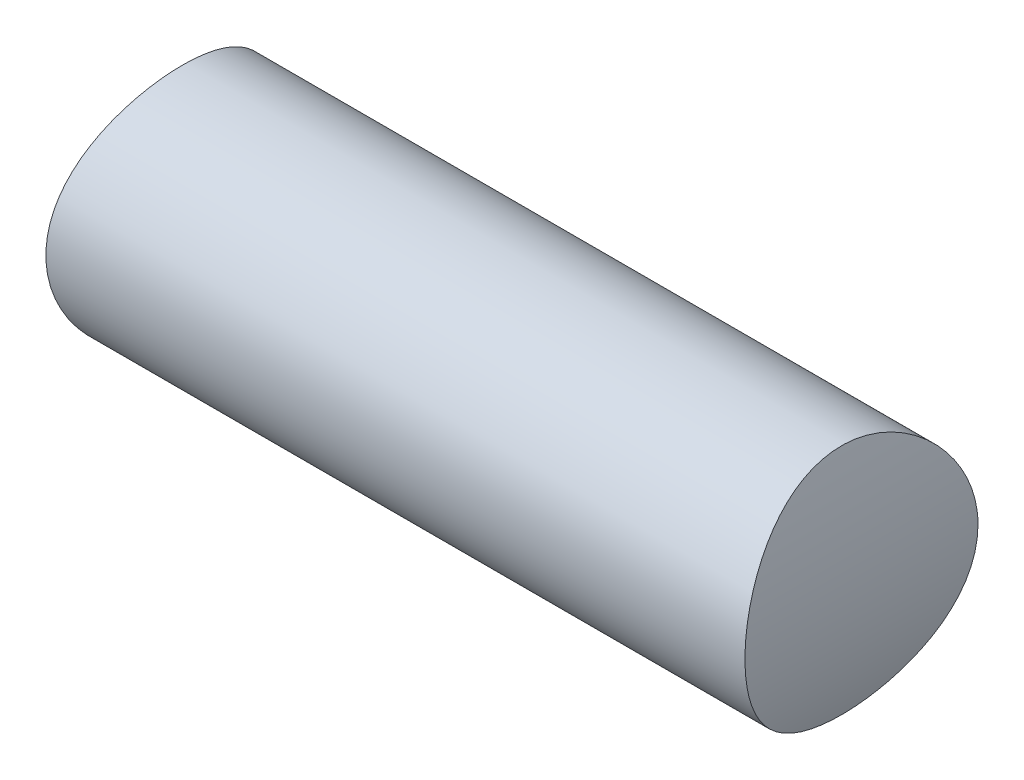
ISO-10303-21;
HEADER;
FILE_DESCRIPTION(('STEP AP214'),'2;1');
FILE_NAME('part.step','',(''),(''),'','','');
FILE_SCHEMA(('AUTOMOTIVE_DESIGN { 1 0 10303 214 1 1 1 1 }'));
ENDSEC;
DATA;
#1=APPLICATION_CONTEXT('core data for automotive mechanical design processes');
#2=APPLICATION_PROTOCOL_DEFINITION('international standard','automotive_design',2000,#1);
#3=PRODUCT_CONTEXT('',#1,'mechanical');
#4=PRODUCT('Part','Part','',(#3));
#5=PRODUCT_RELATED_PRODUCT_CATEGORY('part','',(#4));
#6=PRODUCT_DEFINITION_FORMATION('','',#4);
#7=PRODUCT_DEFINITION_CONTEXT('part definition',#1,'design');
#8=PRODUCT_DEFINITION('design','',#6,#7);
#9=PRODUCT_DEFINITION_SHAPE('','',#8);
#10=(LENGTH_UNIT() NAMED_UNIT(*) SI_UNIT(.MILLI.,.METRE.));
#11=(NAMED_UNIT(*) PLANE_ANGLE_UNIT() SI_UNIT($,.RADIAN.));
#12=(NAMED_UNIT(*) SI_UNIT($,.STERADIAN.) SOLID_ANGLE_UNIT());
#13=UNCERTAINTY_MEASURE_WITH_UNIT(LENGTH_MEASURE(1.E-05),#10,'distance_accuracy_value','');
#14=(GEOMETRIC_REPRESENTATION_CONTEXT(3) GLOBAL_UNCERTAINTY_ASSIGNED_CONTEXT((#13)) GLOBAL_UNIT_ASSIGNED_CONTEXT((#10,
#11,#12)) REPRESENTATION_CONTEXT('',''));
#15=CARTESIAN_POINT('',(0.,0.,0.));
#16=DIRECTION('',(0.,0.,1.));
#17=DIRECTION('',(1.,0.,0.));
#18=AXIS2_PLACEMENT_3D('',#15,#16,#17);
#19=CARTESIAN_POINT('',(0.,0.,0.));
#20=DIRECTION('',(1.,0.,0.));
#21=DIRECTION('',(0.,0.,-1.));
#22=AXIS2_PLACEMENT_3D('',#19,#20,#21);
#23=CYLINDRICAL_SURFACE('',#22,2.5);
#24=CARTESIAN_POINT('',(15.,0.,-2.5));
#25=CARTESIAN_POINT('',(14.9999945505398,-0.136218406325858,-2.49999234478447));
#26=CARTESIAN_POINT('',(14.9962486498376,-0.272577030514109,-2.48881477999073));
#27=CARTESIAN_POINT('',(14.9816487347064,-0.541419384923744,-2.44448127793192));
#28=CARTESIAN_POINT('',(14.9707828903594,-0.673896282200597,-2.41128876129634));
#29=CARTESIAN_POINT('',(14.9431300742028,-0.930846738765843,-2.32419431409327));
#30=CARTESIAN_POINT('',(14.9263566959019,-1.05533790266234,-2.27033990229799));
#31=CARTESIAN_POINT('',(14.888604537229,-1.29347534144741,-2.143623887941));
#32=CARTESIAN_POINT('',(14.8676262707264,-1.40712293900034,-2.07076460759221));
#33=CARTESIAN_POINT('',(14.8228529294597,-1.62435082651193,-1.90543765977625));
#34=CARTESIAN_POINT('',(14.7989901570557,-1.72750371232062,-1.81242679082949));
#35=CARTESIAN_POINT('',(14.7515091162675,-1.91707732111445,-1.61058783000865));
#36=CARTESIAN_POINT('',(14.7278909162144,-2.00349348137674,-1.50175543902832));
#37=CARTESIAN_POINT('',(14.6828332565964,-2.15956250575991,-1.26753693376686));
#38=CARTESIAN_POINT('',(14.6614758834451,-2.22866245329346,-1.14176507306779));
#39=CARTESIAN_POINT('',(14.6243825639778,-2.34454740728067,-0.879559141639127));
#40=CARTESIAN_POINT('',(14.6086448770101,-2.39133932497118,-0.743128388399764));
#41=CARTESIAN_POINT('',(14.5852825822075,-2.45968364998001,-0.468316952779924));
#42=CARTESIAN_POINT('',(14.5774023949477,-2.48203361856385,-0.330156992106138));
#43=CARTESIAN_POINT('',(14.5698914157475,-2.50335280841647,-0.0518406278399167));
#44=CARTESIAN_POINT('',(14.5702580754299,-2.5023292523906,0.0883151456432164));
#45=CARTESIAN_POINT('',(14.5789753651933,-2.47754978963836,0.359841266019333));
#46=CARTESIAN_POINT('',(14.5869603591589,-2.45483489729083,0.491320391518712));
#47=CARTESIAN_POINT('',(14.6094163751838,-2.38901560125363,0.748482959510515));
#48=CARTESIAN_POINT('',(14.6238882040819,-2.34590866114436,0.874165678894963));
#49=CARTESIAN_POINT('',(14.6579482383255,-2.23984624460369,1.11853516851687));
#50=CARTESIAN_POINT('',(14.6776152004909,-2.17658184694413,1.23707640646709));
#51=CARTESIAN_POINT('',(14.7198151727564,-2.03221829653571,1.46218300249326));
#52=CARTESIAN_POINT('',(14.7423488571756,-1.95111494437167,1.56874553175672));
#53=CARTESIAN_POINT('',(14.7891791300972,-1.7683897961248,1.77271109254951));
#54=CARTESIAN_POINT('',(14.8135064258794,-1.66591966662859,1.86934854894796));
#55=CARTESIAN_POINT('',(14.8601657927511,-1.4458874624799,2.04430145972414));
#56=CARTESIAN_POINT('',(14.8824969870423,-1.32831881043449,2.12260888674646));
#57=CARTESIAN_POINT('',(14.922945152879,-1.07976853768722,2.25929910580659));
#58=CARTESIAN_POINT('',(14.9410148869344,-0.948657815378988,2.31746163288761));
#59=CARTESIAN_POINT('',(14.9705337938139,-0.677908001637197,2.41057008373953));
#60=CARTESIAN_POINT('',(14.9819965106578,-0.538287010567706,2.44556352492319));
#61=CARTESIAN_POINT('',(14.9929759835069,-0.331144677356517,2.47886388418476));
#62=CARTESIAN_POINT('',(14.9956020618003,-0.265203234675841,2.48678003124991));
#63=CARTESIAN_POINT('',(14.9991154006702,-0.13285231528657,2.49734996095024));
#64=CARTESIAN_POINT('',(15.0000026580666,-0.0664428377222204,2.50000373396119));
#65=CARTESIAN_POINT('',(14.9999945505398,0.136218406325857,2.49999234478447));
#66=CARTESIAN_POINT('',(14.9962486498376,0.272577030514108,2.48881477999073));
#67=CARTESIAN_POINT('',(14.9816487347064,0.541419384923743,2.44448127793192));
#68=CARTESIAN_POINT('',(14.9707828903594,0.673896282200597,2.41128876129634));
#69=CARTESIAN_POINT('',(14.9431300742028,0.930846738765842,2.32419431409327));
#70=CARTESIAN_POINT('',(14.9263566959019,1.05533790266234,2.27033990229799));
#71=CARTESIAN_POINT('',(14.888604537229,1.29347534144741,2.143623887941));
#72=CARTESIAN_POINT('',(14.8676262707264,1.40712293900034,2.07076460759221));
#73=CARTESIAN_POINT('',(14.8228529294597,1.62435082651193,1.90543765977625));
#74=CARTESIAN_POINT('',(14.7989901570557,1.72750371232062,1.81242679082949));
#75=CARTESIAN_POINT('',(14.7515091162675,1.91707732111445,1.61058783000865));
#76=CARTESIAN_POINT('',(14.7278909162144,2.00349348137674,1.50175543902832));
#77=CARTESIAN_POINT('',(14.6828332565964,2.1595625057599,1.26753693376686));
#78=CARTESIAN_POINT('',(14.6614758834451,2.22866245329346,1.14176507306779));
#79=CARTESIAN_POINT('',(14.6243825639778,2.34454740728067,0.879559141639127));
#80=CARTESIAN_POINT('',(14.6086448770101,2.39133932497118,0.743128388399764));
#81=CARTESIAN_POINT('',(14.5852825822075,2.45968364998001,0.468316952779924));
#82=CARTESIAN_POINT('',(14.5774023949477,2.48203361856385,0.330156992106137));
#83=CARTESIAN_POINT('',(14.5698914157475,2.50335280841647,0.051840627839916));
#84=CARTESIAN_POINT('',(14.5702580754299,2.5023292523906,-0.0883151456432167));
#85=CARTESIAN_POINT('',(14.5789753651933,2.47754978963836,-0.359841266019333));
#86=CARTESIAN_POINT('',(14.5869603591589,2.45483489729083,-0.491320391518712));
#87=CARTESIAN_POINT('',(14.6094163751838,2.38901560125363,-0.748482959510516));
#88=CARTESIAN_POINT('',(14.6238882040819,2.34590866114436,-0.874165678894963));
#89=CARTESIAN_POINT('',(14.6579482383255,2.23984624460369,-1.11853516851687));
#90=CARTESIAN_POINT('',(14.6776152004909,2.17658184694413,-1.23707640646709));
#91=CARTESIAN_POINT('',(14.7198151727564,2.03221829653571,-1.46218300249326));
#92=CARTESIAN_POINT('',(14.7423488571756,1.95111494437167,-1.56874553175672));
#93=CARTESIAN_POINT('',(14.7891791300972,1.7683897961248,-1.77271109254951));
#94=CARTESIAN_POINT('',(14.8135064258794,1.66591966662859,-1.86934854894796));
#95=CARTESIAN_POINT('',(14.8601657927511,1.4458874624799,-2.04430145972414));
#96=CARTESIAN_POINT('',(14.8824969870423,1.32831881043449,-2.12260888674646));
#97=CARTESIAN_POINT('',(14.922945152879,1.07976853768722,-2.25929910580659));
#98=CARTESIAN_POINT('',(14.9410148869344,0.948657815378988,-2.31746163288761));
#99=CARTESIAN_POINT('',(14.9705337938139,0.677908001637196,-2.41057008373953));
#100=CARTESIAN_POINT('',(14.9819965106578,0.538287010567705,-2.44556352492319));
#101=CARTESIAN_POINT('',(14.9929759835069,0.331144677356517,-2.47886388418476));
#102=CARTESIAN_POINT('',(14.9956020618003,0.265203234675841,-2.48678003124991));
#103=CARTESIAN_POINT('',(14.9991154006702,0.13285231528657,-2.49734996095024));
#104=CARTESIAN_POINT('',(15.0000026580666,0.0664428377222204,-2.50000373396119));
#105=CARTESIAN_POINT('',(15.,0.,-2.5));
#106=B_SPLINE_CURVE_WITH_KNOTS('',3,(#24,#25,#26,#27,#28,#29,#30,#31,#32,#33,#34,#35,#36,#37,
#38,#39,#40,#41,#42,#43,#44,#45,#46,#47,#48,#49,#50,#51,#52,#53,#54,#55,#56,#57,#58,#59,#60,#61,
#62,#63,#64,#65,#66,#67,#68,#69,#70,#71,#72,#73,#74,#75,#76,#77,#78,#79,#80,#81,#82,#83,#84,#85,
#86,#87,#88,#89,#90,#91,#92,#93,#94,#95,#96,#97,#98,#99,#100,#101,#102,#103,#104,#105),
.UNSPECIFIED.,.T.,.F.,(4,2,2,2,2,2,2,2,2,2,2,2,2,2,2,2,2,2,2,2,2,2,2,2,2,2,2,2,2,2,2,2,2,2,2,2,
2,2,2,2,4),(0.,0.408398847766774,0.817477984261934,1.2256218953619,1.63371595852781,
2.05460611183079,2.47561084610548,2.90871062160145,3.34167613139054,3.76004813773515,
4.17829086375593,4.57741974575075,4.97659828556393,5.38221513766505,5.78792757721052,
6.21475982924772,6.64177865766524,7.07332913204434,7.50399177637989,7.70319487582342,
7.90239833958439,8.31079718735116,8.71987632384632,9.12802023494628,9.5361142981122,
9.95700445141518,10.3780091856899,10.8111089611858,11.2440744709749,11.6624464773195,
12.0806892033403,12.4798180853351,12.8789966251483,13.2846134772494,13.6903259167949,
14.1171581688321,14.5441769972496,14.9757274716287,15.4063901159643,15.6055932154078,
15.8047966791688),.UNSPECIFIED.);
#107=CARTESIAN_POINT('',(15.,0.,-2.5));
#108=VERTEX_POINT('',#107);
#109=EDGE_CURVE('E48',#108,#108,#106,.T.);
#110=ORIENTED_EDGE('',*,*,#109,.T.);
#111=EDGE_LOOP('',(#110));
#112=FACE_BOUND('',#111,.T.);
#113=CARTESIAN_POINT('',(0.,0.,-2.5));
#114=CARTESIAN_POINT('',(-3.82523601387184E-07,0.136408407216808,-2.5000006343291));
#115=CARTESIAN_POINT('',(0.00375576231138066,0.272812986346375,-2.48879933468196));
#116=CARTESIAN_POINT('',(0.0183697449179817,0.54160440218243,-2.44442722795695));
#117=CARTESIAN_POINT('',(0.029228319946187,0.673990820297044,-2.41125414012769));
#118=CARTESIAN_POINT('',(0.056867302338935,0.93083197375444,-2.32420189153988));
#119=CARTESIAN_POINT('',(0.073637806728667,1.05529956471509,-2.27035734385182));
#120=CARTESIAN_POINT('',(0.111388857066455,1.29343734201331,-2.14364706790413));
#121=CARTESIAN_POINT('',(0.132370233305551,1.40710539239676,-2.0707775874935));
#122=CARTESIAN_POINT('',(0.177147638924874,1.62435418755567,-1.90543548785312));
#123=CARTESIAN_POINT('',(0.20101108840538,1.72750925074577,-1.81242191434877));
#124=CARTESIAN_POINT('',(0.248492130421965,1.91708173175521,-1.61058211323358));
#125=CARTESIAN_POINT('',(0.272109667736273,2.00349546372366,-1.50175241267872));
#126=CARTESIAN_POINT('',(0.317166688068155,2.15956235556965,-1.26753721200885));
#127=CARTESIAN_POINT('',(0.338524018107796,2.22866214555258,-1.14176565066969));
#128=CARTESIAN_POINT('',(0.375617364534972,2.3445471846943,-0.879559763853634));
#129=CARTESIAN_POINT('',(0.391355095981361,2.39133924346691,-0.743128707093141));
#130=CARTESIAN_POINT('',(0.41471741826557,2.45968365377291,-0.468316946258225));
#131=CARTESIAN_POINT('',(0.422597605759719,2.48203362067942,-0.330156978777339));
#132=CARTESIAN_POINT('',(0.430108584262313,2.50335280833619,-0.0518406146102982));
#133=CARTESIAN_POINT('',(0.429741924431751,2.5023292540118,0.0883151517729759));
#134=CARTESIAN_POINT('',(0.421024624795496,2.47754975925855,0.359841576110053));
#135=CARTESIAN_POINT('',(0.413039603311677,2.45483478291749,0.491321007297547));
#136=CARTESIAN_POINT('',(0.390583556886227,2.38901540712354,0.748483549017086));
#137=CARTESIAN_POINT('',(0.37611175539731,2.34590856647968,0.874165963587676));
#138=CARTESIAN_POINT('',(0.342052221718781,2.23984764515053,1.1185318739787));
#139=CARTESIAN_POINT('',(0.322385855172067,2.17658512176816,1.23707006367381));
#140=CARTESIAN_POINT('',(0.28018603560684,2.03222276575785,1.46217727069932));
#141=CARTESIAN_POINT('',(0.257651755238411,1.95111778091001,1.56874281733345));
#142=CARTESIAN_POINT('',(0.210816770806478,1.76837333170559,1.77272899540193));
#143=CARTESIAN_POINT('',(0.18648526612893,1.66588287519078,1.86938173627267));
#144=CARTESIAN_POINT('',(0.139826540324083,1.44584892492516,2.0443281666585));
#145=CARTESIAN_POINT('',(0.117499511548315,1.32830398915204,2.12262009541124));
#146=CARTESIAN_POINT('',(0.0770723015551593,1.07986903261567,2.25924075058767));
#147=CARTESIAN_POINT('',(0.0590162497990193,0.948858191040841,2.31736372835183));
#148=CARTESIAN_POINT('',(0.0294858213891299,0.678172708411269,2.41050793488928));
#149=CARTESIAN_POINT('',(0.0180091586280194,0.538501095387384,2.44553718855859));
#150=CARTESIAN_POINT('',(0.00330932321399005,0.260959573823259,2.4901391650559));
#151=CARTESIAN_POINT('',(-0.00025004584320149,0.123273999662115,2.50074952293188));
#152=CARTESIAN_POINT('',(0.000277432629315033,-0.151937674900594,2.49916831600383));
#153=CARTESIAN_POINT('',(0.00436298951594277,-0.289463798299127,2.48698060005031));
#154=CARTESIAN_POINT('',(0.0194993820723938,-0.556299665760639,2.4409702306601));
#155=CARTESIAN_POINT('',(0.0303450322201931,-0.685732017087109,2.40778448487626));
#156=CARTESIAN_POINT('',(0.0577038292482519,-0.937139896448934,2.32151638883318));
#157=CARTESIAN_POINT('',(0.0742176988331239,-1.05911447127152,2.26843150133054));
#158=CARTESIAN_POINT('',(0.111776717817756,-1.29572074098318,2.14232392039803));
#159=CARTESIAN_POINT('',(0.132929631105348,-1.41007489804287,2.06881351679207));
#160=CARTESIAN_POINT('',(0.177368652093439,-1.62516207533897,1.90451462496629));
#161=CARTESIAN_POINT('',(0.200655410154311,-1.72589091948894,1.81372085992059));
#162=CARTESIAN_POINT('',(0.248078800488882,-1.91563126951575,1.61255312248353));
#163=CARTESIAN_POINT('',(0.272205972814302,-2.00390242311443,1.50147693268285));
#164=CARTESIAN_POINT('',(0.317500667632283,-2.16064380580894,1.26557108047278));
#165=CARTESIAN_POINT('',(0.338668165449942,-2.22911386982753,1.14074130341481));
#166=CARTESIAN_POINT('',(0.375440205215413,-2.3439923260409,0.88081746177526));
#167=CARTESIAN_POINT('',(0.391055980175532,-2.39044533041255,0.745744802078086));
#168=CARTESIAN_POINT('',(0.414729192338763,-2.45973666689839,0.469053374889674));
#169=CARTESIAN_POINT('',(0.422790034409016,-2.48258563738485,0.327437586489126));
#170=CARTESIAN_POINT('',(0.43005352814557,-2.50319070619335,0.0495072598977095));
#171=CARTESIAN_POINT('',(0.429689993564622,-2.502175643271,-0.0867058507170575));
#172=CARTESIAN_POINT('',(0.421218254403316,-2.47810573362173,-0.356912687305156));
#173=CARTESIAN_POINT('',(0.413110510765959,-2.45505219864646,-0.490906544887721));
#174=CARTESIAN_POINT('',(0.390386892377708,-2.38842953282336,-0.750339157506181));
#175=CARTESIAN_POINT('',(0.375897549438062,-2.34525836503879,-0.875892062511241));
#176=CARTESIAN_POINT('',(0.342090029538287,-2.23994841439937,-1.11806851734567));
#177=CARTESIAN_POINT('',(0.322770780915172,-2.17780542138451,-1.23469007797002));
#178=CARTESIAN_POINT('',(0.280429269348845,-2.03315173145857,-1.46120917480728));
#179=CARTESIAN_POINT('',(0.257282208946575,-1.94987060691145,-1.57059125474597));
#180=CARTESIAN_POINT('',(0.210416092918679,-1.76660720783912,-1.7742245334605));
#181=CARTESIAN_POINT('',(0.186696877190693,-1.6666202111287,-1.86847143922019));
#182=CARTESIAN_POINT('',(0.140249236861397,-1.44810389230172,-2.04286103072295));
#183=CARTESIAN_POINT('',(0.117595454968585,-1.32900378374932,-2.1223108693775));
#184=CARTESIAN_POINT('',(0.076850220684699,-1.07839339351656,-2.25997607212662));
#185=CARTESIAN_POINT('',(0.0587576023017544,-0.946886295330871,-2.31819686480511));
#186=CARTESIAN_POINT('',(0.0298621232864538,-0.681234118002439,-2.40930408122168));
#187=CARTESIAN_POINT('',(0.018769689436933,-0.547469394191022,-2.44320616565844));
#188=CARTESIAN_POINT('',(0.00383982339445493,-0.275801040025618,-2.48855070169282));
#189=CARTESIAN_POINT('',(3.86702376882627E-07,-0.137898563921866,-2.49999935874134));
#190=CARTESIAN_POINT('',(0.,0.,-2.5));
#191=B_SPLINE_CURVE_WITH_KNOTS('',3,(#113,#114,#115,#116,#117,#118,#119,#120,#121,#122,#123,
#124,#125,#126,#127,#128,#129,#130,#131,#132,#133,#134,#135,#136,#137,#138,#139,#140,#141,#142,
#143,#144,#145,#146,#147,#148,#149,#150,#151,#152,#153,#154,#155,#156,#157,#158,#159,#160,#161,
#162,#163,#164,#165,#166,#167,#168,#169,#170,#171,#172,#173,#174,#175,#176,#177,#178,#179,#180,
#181,#182,#183,#184,#185,#186,#187,#188,#189,#190),.UNSPECIFIED.,.T.,.F.,(4,2,2,2,2,2,2,2,2,2,2,
2,2,2,2,2,2,2,2,2,2,2,2,2,2,2,2,2,2,2,2,2,2,2,2,2,2,2,4),(0.,0.408717765065027,
0.817477963168802,1.22555668217568,1.63371594449775,2.0546171070689,2.47561083218826,
2.90870962058676,3.34167611732083,3.760048143546,4.17829084968714,4.57742066378201,
4.97659827138705,5.38220427887827,5.78792756395518,6.21483264528417,6.64177864916546,
7.07296014125894,7.50399172193021,7.91633957937924,8.32861782910441,8.72895394945534,
9.1293411321026,9.54025999609341,9.95130452054728,10.3810255720188,10.8107502058749,
11.2396003456693,11.668257117646,12.0748916516065,12.4815019837844,12.8803896770104,
13.2793659543994,13.6957516672951,14.1122552780945,14.5449915208775,14.9776170288114,
15.3909139593453,15.8040966509535),.UNSPECIFIED.);
#192=CARTESIAN_POINT('',(0.,0.,-2.5));
#193=VERTEX_POINT('',#192);
#194=EDGE_CURVE('E11',#193,#193,#191,.T.);
#195=ORIENTED_EDGE('',*,*,#194,.T.);
#196=EDGE_LOOP('',(#195));
#197=FACE_BOUND('',#196,.T.);
#198=ADVANCED_FACE('F38',(#112,#197),#23,.T.);
#199=CARTESIAN_POINT('',(7.5,0.,-2.5));
#200=DIRECTION('',(0.,0.,1.));
#201=DIRECTION('',(1.,0.,0.));
#202=AXIS2_PLACEMENT_3D('',#199,#200,#201);
#203=CYLINDRICAL_SURFACE('',#202,7.5);
#204=ORIENTED_EDGE('',*,*,#109,.F.);
#205=EDGE_LOOP('',(#204));
#206=FACE_BOUND('',#205,.T.);
#207=ADVANCED_FACE('F60',(#206),#203,.T.);
#208=ORIENTED_EDGE('',*,*,#194,.F.);
#209=EDGE_LOOP('',(#208));
#210=FACE_BOUND('',#209,.T.);
#211=ADVANCED_FACE('F57',(#210),#203,.T.);
#212=CLOSED_SHELL('',(#198,#207,#211));
#213=MANIFOLD_SOLID_BREP('B2',#212);
#214=ADVANCED_BREP_SHAPE_REPRESENTATION('',(#18,#213),#14);
#215=SHAPE_DEFINITION_REPRESENTATION(#9,#214);
ENDSEC;
END-ISO-10303-21;
